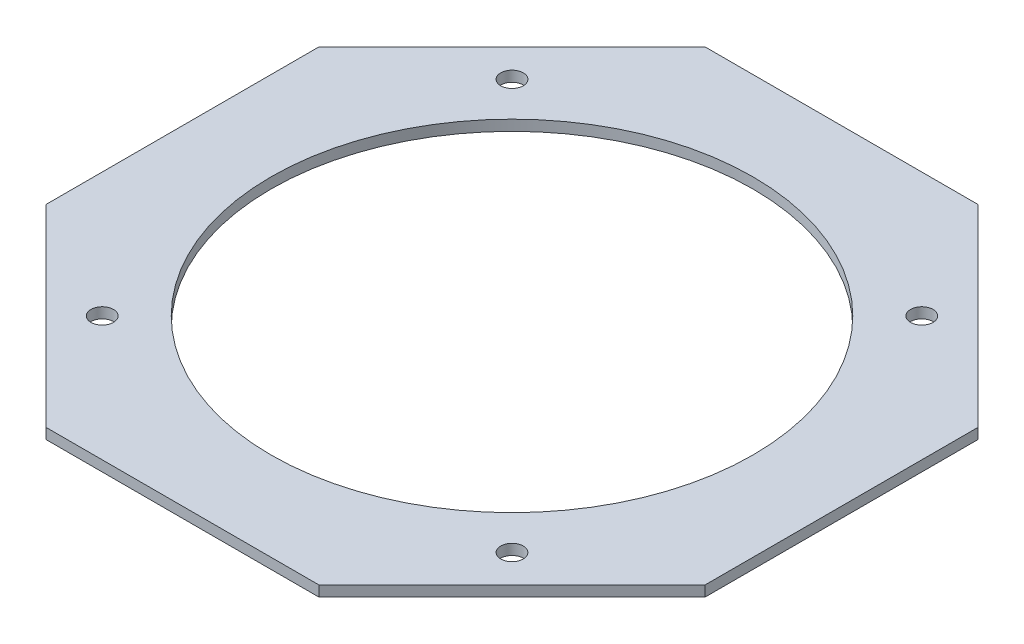
ISO-10303-21;
HEADER;
FILE_DESCRIPTION(('STEP AP214'),'2;1');
FILE_NAME('part.step','',(''),(''),'','','');
FILE_SCHEMA(('AUTOMOTIVE_DESIGN { 1 0 10303 214 1 1 1 1 }'));
ENDSEC;
DATA;
#1=APPLICATION_CONTEXT('core data for automotive mechanical design processes');
#2=APPLICATION_PROTOCOL_DEFINITION('international standard','automotive_design',2000,#1);
#3=PRODUCT_CONTEXT('',#1,'mechanical');
#4=PRODUCT('Part','Part','',(#3));
#5=PRODUCT_RELATED_PRODUCT_CATEGORY('part','',(#4));
#6=PRODUCT_DEFINITION_FORMATION('','',#4);
#7=PRODUCT_DEFINITION_CONTEXT('part definition',#1,'design');
#8=PRODUCT_DEFINITION('design','',#6,#7);
#9=PRODUCT_DEFINITION_SHAPE('','',#8);
#10=(LENGTH_UNIT() NAMED_UNIT(*) SI_UNIT(.MILLI.,.METRE.));
#11=(NAMED_UNIT(*) PLANE_ANGLE_UNIT() SI_UNIT($,.RADIAN.));
#12=(NAMED_UNIT(*) SI_UNIT($,.STERADIAN.) SOLID_ANGLE_UNIT());
#13=UNCERTAINTY_MEASURE_WITH_UNIT(LENGTH_MEASURE(1.E-05),#10,'distance_accuracy_value','');
#14=(GEOMETRIC_REPRESENTATION_CONTEXT(3) GLOBAL_UNCERTAINTY_ASSIGNED_CONTEXT((#13)) GLOBAL_UNIT_ASSIGNED_CONTEXT((#10,
#11,#12)) REPRESENTATION_CONTEXT('',''));
#15=CARTESIAN_POINT('',(0.,0.,0.));
#16=DIRECTION('',(0.,0.,1.));
#17=DIRECTION('',(1.,0.,0.));
#18=AXIS2_PLACEMENT_3D('',#15,#16,#17);
#19=CARTESIAN_POINT('',(23.64745227588,1.83,57.09));
#20=DIRECTION('',(-0.707106781186547,0.,-0.707106781186547));
#21=DIRECTION('',(-0.707106781186548,0.,0.707106781186548));
#22=AXIS2_PLACEMENT_3D('',#19,#20,#21);
#23=PLANE('',#22);
#24=DIRECTION('',(0.707106781186547,0.,-0.707106781186547));
#25=VECTOR('',#24,1.);
#26=CARTESIAN_POINT('',(23.64745227588,0.,57.09));
#27=LINE('',#26,#25);
#28=CARTESIAN_POINT('',(23.64745227588,0.,57.09));
#29=VERTEX_POINT('',#28);
#30=CARTESIAN_POINT('',(57.09,0.,23.64745227588));
#31=VERTEX_POINT('',#30);
#32=EDGE_CURVE('E130',#29,#31,#27,.T.);
#33=ORIENTED_EDGE('',*,*,#32,.T.);
#34=DIRECTION('',(0.,-1.,0.));
#35=VECTOR('',#34,1.);
#36=CARTESIAN_POINT('',(57.09,1.83,23.64745227588));
#37=LINE('',#36,#35);
#38=CARTESIAN_POINT('',(57.09,1.83,23.64745227588));
#39=VERTEX_POINT('',#38);
#40=EDGE_CURVE('E11',#39,#31,#37,.T.);
#41=ORIENTED_EDGE('',*,*,#40,.F.);
#42=DIRECTION('',(0.707106781186547,0.,-0.707106781186547));
#43=VECTOR('',#42,1.);
#44=CARTESIAN_POINT('',(23.64745227588,1.83,57.09));
#45=LINE('',#44,#43);
#46=CARTESIAN_POINT('',(23.64745227588,1.83,57.09));
#47=VERTEX_POINT('',#46);
#48=EDGE_CURVE('E145',#47,#39,#45,.T.);
#49=ORIENTED_EDGE('',*,*,#48,.F.);
#50=DIRECTION('',(0.,-1.,0.));
#51=VECTOR('',#50,1.);
#52=CARTESIAN_POINT('',(23.64745227588,1.83,57.09));
#53=LINE('',#52,#51);
#54=EDGE_CURVE('E126',#47,#29,#53,.T.);
#55=ORIENTED_EDGE('',*,*,#54,.T.);
#56=EDGE_LOOP('',(#33,#41,#49,#55));
#57=FACE_BOUND('',#56,.T.);
#58=ADVANCED_FACE('F34',(#57),#23,.F.);
#59=CARTESIAN_POINT('',(57.09,1.83,23.64745227588));
#60=DIRECTION('',(-1.,0.,0.));
#61=DIRECTION('',(0.,0.,1.));
#62=AXIS2_PLACEMENT_3D('',#59,#60,#61);
#63=PLANE('',#62);
#64=DIRECTION('',(0.,0.,-1.));
#65=VECTOR('',#64,1.);
#66=CARTESIAN_POINT('',(57.09,0.,23.64745227588));
#67=LINE('',#66,#65);
#68=CARTESIAN_POINT('',(57.09,0.,-23.64745227588));
#69=VERTEX_POINT('',#68);
#70=EDGE_CURVE('E133',#31,#69,#67,.T.);
#71=ORIENTED_EDGE('',*,*,#70,.T.);
#72=DIRECTION('',(0.,-1.,0.));
#73=VECTOR('',#72,1.);
#74=CARTESIAN_POINT('',(57.09,1.83,-23.64745227588));
#75=LINE('',#74,#73);
#76=CARTESIAN_POINT('',(57.09,1.83,-23.64745227588));
#77=VERTEX_POINT('',#76);
#78=EDGE_CURVE('E42',#77,#69,#75,.T.);
#79=ORIENTED_EDGE('',*,*,#78,.F.);
#80=DIRECTION('',(0.,0.,-1.));
#81=VECTOR('',#80,1.);
#82=CARTESIAN_POINT('',(57.09,1.83,23.64745227588));
#83=LINE('',#82,#81);
#84=EDGE_CURVE('E93',#39,#77,#83,.T.);
#85=ORIENTED_EDGE('',*,*,#84,.F.);
#86=ORIENTED_EDGE('',*,*,#40,.T.);
#87=EDGE_LOOP('',(#71,#79,#85,#86));
#88=FACE_BOUND('',#87,.T.);
#89=ADVANCED_FACE('F227',(#88),#63,.F.);
#90=CARTESIAN_POINT('',(57.09,1.83,-23.64745227588));
#91=DIRECTION('',(-0.707106781186547,0.,0.707106781186548));
#92=DIRECTION('',(0.707106781186548,0.,0.707106781186547));
#93=AXIS2_PLACEMENT_3D('',#90,#91,#92);
#94=PLANE('',#93);
#95=DIRECTION('',(-0.707106781186548,0.,-0.707106781186547));
#96=VECTOR('',#95,1.);
#97=CARTESIAN_POINT('',(57.09,0.,-23.64745227588));
#98=LINE('',#97,#96);
#99=CARTESIAN_POINT('',(23.64745227588,0.,-57.09));
#100=VERTEX_POINT('',#99);
#101=EDGE_CURVE('E136',#69,#100,#98,.T.);
#102=ORIENTED_EDGE('',*,*,#101,.T.);
#103=DIRECTION('',(0.,-1.,0.));
#104=VECTOR('',#103,1.);
#105=CARTESIAN_POINT('',(23.64745227588,1.83,-57.09));
#106=LINE('',#105,#104);
#107=CARTESIAN_POINT('',(23.64745227588,1.83,-57.09));
#108=VERTEX_POINT('',#107);
#109=EDGE_CURVE('E152',#108,#100,#106,.T.);
#110=ORIENTED_EDGE('',*,*,#109,.F.);
#111=DIRECTION('',(-0.707106781186548,0.,-0.707106781186547));
#112=VECTOR('',#111,1.);
#113=CARTESIAN_POINT('',(57.09,1.83,-23.64745227588));
#114=LINE('',#113,#112);
#115=EDGE_CURVE('E160',#77,#108,#114,.T.);
#116=ORIENTED_EDGE('',*,*,#115,.F.);
#117=ORIENTED_EDGE('',*,*,#78,.T.);
#118=EDGE_LOOP('',(#102,#110,#116,#117));
#119=FACE_BOUND('',#118,.T.);
#120=ADVANCED_FACE('F158',(#119),#94,.F.);
#121=CARTESIAN_POINT('',(23.64745227588,1.83,-57.09));
#122=DIRECTION('',(0.,0.,1.));
#123=DIRECTION('',(1.,0.,0.));
#124=AXIS2_PLACEMENT_3D('',#121,#122,#123);
#125=PLANE('',#124);
#126=DIRECTION('',(-1.,0.,0.));
#127=VECTOR('',#126,1.);
#128=CARTESIAN_POINT('',(23.64745227588,0.,-57.09));
#129=LINE('',#128,#127);
#130=CARTESIAN_POINT('',(-23.64745227588,0.,-57.09));
#131=VERTEX_POINT('',#130);
#132=EDGE_CURVE('E138',#100,#131,#129,.T.);
#133=ORIENTED_EDGE('',*,*,#132,.T.);
#134=DIRECTION('',(0.,-1.,0.));
#135=VECTOR('',#134,1.);
#136=CARTESIAN_POINT('',(-23.64745227588,1.83,-57.09));
#137=LINE('',#136,#135);
#138=CARTESIAN_POINT('',(-23.64745227588,1.83,-57.09));
#139=VERTEX_POINT('',#138);
#140=EDGE_CURVE('E149',#139,#131,#137,.T.);
#141=ORIENTED_EDGE('',*,*,#140,.F.);
#142=DIRECTION('',(-1.,0.,0.));
#143=VECTOR('',#142,1.);
#144=CARTESIAN_POINT('',(23.64745227588,1.83,-57.09));
#145=LINE('',#144,#143);
#146=EDGE_CURVE('E172',#108,#139,#145,.T.);
#147=ORIENTED_EDGE('',*,*,#146,.F.);
#148=ORIENTED_EDGE('',*,*,#109,.T.);
#149=EDGE_LOOP('',(#133,#141,#147,#148));
#150=FACE_BOUND('',#149,.T.);
#151=ADVANCED_FACE('F168',(#150),#125,.F.);
#152=CARTESIAN_POINT('',(-23.64745227588,1.83,-57.09));
#153=DIRECTION('',(0.707106781186548,0.,0.707106781186547));
#154=DIRECTION('',(0.707106781186547,0.,-0.707106781186548));
#155=AXIS2_PLACEMENT_3D('',#152,#153,#154);
#156=PLANE('',#155);
#157=DIRECTION('',(-0.707106781186547,0.,0.707106781186548));
#158=VECTOR('',#157,1.);
#159=CARTESIAN_POINT('',(-23.64745227588,0.,-57.09));
#160=LINE('',#159,#158);
#161=CARTESIAN_POINT('',(-57.09,0.,-23.64745227588));
#162=VERTEX_POINT('',#161);
#163=EDGE_CURVE('E140',#131,#162,#160,.T.);
#164=ORIENTED_EDGE('',*,*,#163,.T.);
#165=DIRECTION('',(0.,-1.,0.));
#166=VECTOR('',#165,1.);
#167=CARTESIAN_POINT('',(-57.09,1.83,-23.64745227588));
#168=LINE('',#167,#166);
#169=CARTESIAN_POINT('',(-57.09,1.83,-23.64745227588));
#170=VERTEX_POINT('',#169);
#171=EDGE_CURVE('E121',#170,#162,#168,.T.);
#172=ORIENTED_EDGE('',*,*,#171,.F.);
#173=DIRECTION('',(-0.707106781186547,0.,0.707106781186548));
#174=VECTOR('',#173,1.);
#175=CARTESIAN_POINT('',(-23.64745227588,1.83,-57.09));
#176=LINE('',#175,#174);
#177=EDGE_CURVE('E112',#139,#170,#176,.T.);
#178=ORIENTED_EDGE('',*,*,#177,.F.);
#179=ORIENTED_EDGE('',*,*,#140,.T.);
#180=EDGE_LOOP('',(#164,#172,#178,#179));
#181=FACE_BOUND('',#180,.T.);
#182=ADVANCED_FACE('F171',(#181),#156,.F.);
#183=CARTESIAN_POINT('',(-57.09,1.83,-23.64745227588));
#184=DIRECTION('',(1.,0.,0.));
#185=DIRECTION('',(0.,0.,-1.));
#186=AXIS2_PLACEMENT_3D('',#183,#184,#185);
#187=PLANE('',#186);
#188=DIRECTION('',(0.,0.,1.));
#189=VECTOR('',#188,1.);
#190=CARTESIAN_POINT('',(-57.09,0.,-23.64745227588));
#191=LINE('',#190,#189);
#192=CARTESIAN_POINT('',(-57.09,0.,23.64745227588));
#193=VERTEX_POINT('',#192);
#194=EDGE_CURVE('E120',#162,#193,#191,.T.);
#195=ORIENTED_EDGE('',*,*,#194,.T.);
#196=DIRECTION('',(0.,-1.,0.));
#197=VECTOR('',#196,1.);
#198=CARTESIAN_POINT('',(-57.09,1.83,23.64745227588));
#199=LINE('',#198,#197);
#200=CARTESIAN_POINT('',(-57.09,1.83,23.64745227588));
#201=VERTEX_POINT('',#200);
#202=EDGE_CURVE('E117',#201,#193,#199,.T.);
#203=ORIENTED_EDGE('',*,*,#202,.F.);
#204=DIRECTION('',(0.,0.,1.));
#205=VECTOR('',#204,1.);
#206=CARTESIAN_POINT('',(-57.09,1.83,-23.64745227588));
#207=LINE('',#206,#205);
#208=EDGE_CURVE('E106',#170,#201,#207,.T.);
#209=ORIENTED_EDGE('',*,*,#208,.F.);
#210=ORIENTED_EDGE('',*,*,#171,.T.);
#211=EDGE_LOOP('',(#195,#203,#209,#210));
#212=FACE_BOUND('',#211,.T.);
#213=ADVANCED_FACE('F118',(#212),#187,.F.);
#214=CARTESIAN_POINT('',(-57.09,1.83,23.64745227588));
#215=DIRECTION('',(0.707106781186547,0.,-0.707106781186548));
#216=DIRECTION('',(-0.707106781186548,0.,-0.707106781186547));
#217=AXIS2_PLACEMENT_3D('',#214,#215,#216);
#218=PLANE('',#217);
#219=DIRECTION('',(0.707106781186548,0.,0.707106781186547));
#220=VECTOR('',#219,1.);
#221=CARTESIAN_POINT('',(-57.09,0.,23.64745227588));
#222=LINE('',#221,#220);
#223=CARTESIAN_POINT('',(-23.64745227588,0.,57.09));
#224=VERTEX_POINT('',#223);
#225=EDGE_CURVE('E79',#193,#224,#222,.T.);
#226=ORIENTED_EDGE('',*,*,#225,.T.);
#227=DIRECTION('',(0.,-1.,0.));
#228=VECTOR('',#227,1.);
#229=CARTESIAN_POINT('',(-23.64745227588,1.83,57.09));
#230=LINE('',#229,#228);
#231=CARTESIAN_POINT('',(-23.64745227588,1.83,57.09));
#232=VERTEX_POINT('',#231);
#233=EDGE_CURVE('E122',#232,#224,#230,.T.);
#234=ORIENTED_EDGE('',*,*,#233,.F.);
#235=DIRECTION('',(0.707106781186548,0.,0.707106781186547));
#236=VECTOR('',#235,1.);
#237=CARTESIAN_POINT('',(-57.09,1.83,23.64745227588));
#238=LINE('',#237,#236);
#239=EDGE_CURVE('E110',#201,#232,#238,.T.);
#240=ORIENTED_EDGE('',*,*,#239,.F.);
#241=ORIENTED_EDGE('',*,*,#202,.T.);
#242=EDGE_LOOP('',(#226,#234,#240,#241));
#243=FACE_BOUND('',#242,.T.);
#244=ADVANCED_FACE('F124',(#243),#218,.F.);
#245=CARTESIAN_POINT('',(-23.64745227588,1.83,57.09));
#246=DIRECTION('',(0.,0.,-1.));
#247=DIRECTION('',(-1.,0.,0.));
#248=AXIS2_PLACEMENT_3D('',#245,#246,#247);
#249=PLANE('',#248);
#250=DIRECTION('',(1.,0.,0.));
#251=VECTOR('',#250,1.);
#252=CARTESIAN_POINT('',(-23.64745227588,0.,57.09));
#253=LINE('',#252,#251);
#254=EDGE_CURVE('E85',#224,#29,#253,.T.);
#255=ORIENTED_EDGE('',*,*,#254,.T.);
#256=ORIENTED_EDGE('',*,*,#54,.F.);
#257=DIRECTION('',(1.,0.,0.));
#258=VECTOR('',#257,1.);
#259=CARTESIAN_POINT('',(-23.64745227588,1.83,57.09));
#260=LINE('',#259,#258);
#261=EDGE_CURVE('E50',#232,#47,#260,.T.);
#262=ORIENTED_EDGE('',*,*,#261,.F.);
#263=ORIENTED_EDGE('',*,*,#233,.T.);
#264=EDGE_LOOP('',(#255,#256,#262,#263));
#265=FACE_BOUND('',#264,.T.);
#266=ADVANCED_FACE('F234',(#265),#249,.F.);
#267=CARTESIAN_POINT('',(0.,1.83,0.));
#268=DIRECTION('',(0.,1.,0.));
#269=DIRECTION('',(0.,0.,1.));
#270=AXIS2_PLACEMENT_3D('',#267,#268,#269);
#271=PLANE('',#270);
#272=CARTESIAN_POINT('',(-35.5,1.83,35.5));
#273=DIRECTION('',(0.,1.,0.));
#274=DIRECTION('',(0.,0.,1.));
#275=AXIS2_PLACEMENT_3D('',#272,#273,#274);
#276=CIRCLE('',#275,1.95);
#277=CARTESIAN_POINT('',(-35.5,1.83,33.55));
#278=VERTEX_POINT('',#277);
#279=EDGE_CURVE('E183',#278,#278,#276,.F.);
#280=ORIENTED_EDGE('',*,*,#279,.T.);
#281=EDGE_LOOP('',(#280));
#282=FACE_BOUND('',#281,.T.);
#283=CARTESIAN_POINT('',(0.,1.83,0.));
#284=DIRECTION('',(0.,1.,0.));
#285=DIRECTION('',(0.,0.,1.));
#286=AXIS2_PLACEMENT_3D('',#283,#284,#285);
#287=CIRCLE('',#286,41.75);
#288=CARTESIAN_POINT('',(0.,1.83,-41.75));
#289=VERTEX_POINT('',#288);
#290=EDGE_CURVE('E186',#289,#289,#287,.F.);
#291=ORIENTED_EDGE('',*,*,#290,.T.);
#292=EDGE_LOOP('',(#291));
#293=FACE_BOUND('',#292,.T.);
#294=CARTESIAN_POINT('',(35.5,1.83,35.5));
#295=DIRECTION('',(0.,1.,0.));
#296=DIRECTION('',(0.,0.,1.));
#297=AXIS2_PLACEMENT_3D('',#294,#295,#296);
#298=CIRCLE('',#297,1.95);
#299=CARTESIAN_POINT('',(35.5,1.83,33.55));
#300=VERTEX_POINT('',#299);
#301=EDGE_CURVE('E189',#300,#300,#298,.F.);
#302=ORIENTED_EDGE('',*,*,#301,.T.);
#303=EDGE_LOOP('',(#302));
#304=FACE_BOUND('',#303,.T.);
#305=CARTESIAN_POINT('',(35.5,1.83,-35.5));
#306=DIRECTION('',(0.,1.,0.));
#307=DIRECTION('',(0.,0.,1.));
#308=AXIS2_PLACEMENT_3D('',#305,#306,#307);
#309=CIRCLE('',#308,1.95);
#310=CARTESIAN_POINT('',(35.5,1.83,-37.45));
#311=VERTEX_POINT('',#310);
#312=EDGE_CURVE('E192',#311,#311,#309,.F.);
#313=ORIENTED_EDGE('',*,*,#312,.T.);
#314=EDGE_LOOP('',(#313));
#315=FACE_BOUND('',#314,.T.);
#316=CARTESIAN_POINT('',(-35.5,1.83,-35.5));
#317=DIRECTION('',(0.,1.,0.));
#318=DIRECTION('',(0.,0.,1.));
#319=AXIS2_PLACEMENT_3D('',#316,#317,#318);
#320=CIRCLE('',#319,1.95);
#321=CARTESIAN_POINT('',(-35.5,1.83,-37.45));
#322=VERTEX_POINT('',#321);
#323=EDGE_CURVE('E134',#322,#322,#320,.F.);
#324=ORIENTED_EDGE('',*,*,#323,.T.);
#325=EDGE_LOOP('',(#324));
#326=FACE_BOUND('',#325,.T.);
#327=ORIENTED_EDGE('',*,*,#48,.T.);
#328=ORIENTED_EDGE('',*,*,#84,.T.);
#329=ORIENTED_EDGE('',*,*,#115,.T.);
#330=ORIENTED_EDGE('',*,*,#146,.T.);
#331=ORIENTED_EDGE('',*,*,#177,.T.);
#332=ORIENTED_EDGE('',*,*,#208,.T.);
#333=ORIENTED_EDGE('',*,*,#239,.T.);
#334=ORIENTED_EDGE('',*,*,#261,.T.);
#335=EDGE_LOOP('',(#327,#328,#329,#330,#331,#332,#333,#334));
#336=FACE_BOUND('',#335,.T.);
#337=ADVANCED_FACE('F108',(#282,#293,#304,#315,#326,#336),#271,.T.);
#338=CARTESIAN_POINT('',(0.,0.,0.));
#339=DIRECTION('',(0.,1.,0.));
#340=DIRECTION('',(0.,0.,1.));
#341=AXIS2_PLACEMENT_3D('',#338,#339,#340);
#342=PLANE('',#341);
#343=CARTESIAN_POINT('',(-35.5,0.,35.5));
#344=DIRECTION('',(0.,1.,0.));
#345=DIRECTION('',(0.,0.,1.));
#346=AXIS2_PLACEMENT_3D('',#343,#344,#345);
#347=CIRCLE('',#346,1.95);
#348=CARTESIAN_POINT('',(-35.5,0.,33.55));
#349=VERTEX_POINT('',#348);
#350=EDGE_CURVE('E199',#349,#349,#347,.T.);
#351=ORIENTED_EDGE('',*,*,#350,.T.);
#352=EDGE_LOOP('',(#351));
#353=FACE_BOUND('',#352,.T.);
#354=CARTESIAN_POINT('',(0.,0.,0.));
#355=DIRECTION('',(0.,1.,0.));
#356=DIRECTION('',(0.,0.,1.));
#357=AXIS2_PLACEMENT_3D('',#354,#355,#356);
#358=CIRCLE('',#357,41.75);
#359=CARTESIAN_POINT('',(0.,0.,-41.75));
#360=VERTEX_POINT('',#359);
#361=EDGE_CURVE('E204',#360,#360,#358,.T.);
#362=ORIENTED_EDGE('',*,*,#361,.T.);
#363=EDGE_LOOP('',(#362));
#364=FACE_BOUND('',#363,.T.);
#365=CARTESIAN_POINT('',(35.5,0.,35.5));
#366=DIRECTION('',(0.,1.,0.));
#367=DIRECTION('',(0.,0.,1.));
#368=AXIS2_PLACEMENT_3D('',#365,#366,#367);
#369=CIRCLE('',#368,1.95);
#370=CARTESIAN_POINT('',(35.5,0.,33.55));
#371=VERTEX_POINT('',#370);
#372=EDGE_CURVE('E196',#371,#371,#369,.T.);
#373=ORIENTED_EDGE('',*,*,#372,.T.);
#374=EDGE_LOOP('',(#373));
#375=FACE_BOUND('',#374,.T.);
#376=CARTESIAN_POINT('',(35.5,0.,-35.5));
#377=DIRECTION('',(0.,1.,0.));
#378=DIRECTION('',(0.,0.,1.));
#379=AXIS2_PLACEMENT_3D('',#376,#377,#378);
#380=CIRCLE('',#379,1.95);
#381=CARTESIAN_POINT('',(35.5,0.,-37.45));
#382=VERTEX_POINT('',#381);
#383=EDGE_CURVE('E195',#382,#382,#380,.T.);
#384=ORIENTED_EDGE('',*,*,#383,.T.);
#385=EDGE_LOOP('',(#384));
#386=FACE_BOUND('',#385,.T.);
#387=CARTESIAN_POINT('',(-35.5,0.,-35.5));
#388=DIRECTION('',(0.,1.,0.));
#389=DIRECTION('',(0.,0.,1.));
#390=AXIS2_PLACEMENT_3D('',#387,#388,#389);
#391=CIRCLE('',#390,1.95);
#392=CARTESIAN_POINT('',(-35.5,0.,-37.45));
#393=VERTEX_POINT('',#392);
#394=EDGE_CURVE('E180',#393,#393,#391,.T.);
#395=ORIENTED_EDGE('',*,*,#394,.T.);
#396=EDGE_LOOP('',(#395));
#397=FACE_BOUND('',#396,.T.);
#398=ORIENTED_EDGE('',*,*,#32,.F.);
#399=ORIENTED_EDGE('',*,*,#254,.F.);
#400=ORIENTED_EDGE('',*,*,#225,.F.);
#401=ORIENTED_EDGE('',*,*,#194,.F.);
#402=ORIENTED_EDGE('',*,*,#163,.F.);
#403=ORIENTED_EDGE('',*,*,#132,.F.);
#404=ORIENTED_EDGE('',*,*,#101,.F.);
#405=ORIENTED_EDGE('',*,*,#70,.F.);
#406=EDGE_LOOP('',(#398,#399,#400,#401,#402,#403,#404,#405));
#407=FACE_BOUND('',#406,.T.);
#408=ADVANCED_FACE('F164',(#353,#364,#375,#386,#397,#407),#342,.F.);
#409=CARTESIAN_POINT('',(-35.5,23.83,-35.5));
#410=DIRECTION('',(0.,-1.,0.));
#411=DIRECTION('',(0.,0.,-1.));
#412=AXIS2_PLACEMENT_3D('',#409,#410,#411);
#413=CYLINDRICAL_SURFACE('',#412,1.95);
#414=CARTESIAN_POINT('',(-35.5,1.83,-37.45));
#415=CARTESIAN_POINT('',(-35.5,1.8109375,-37.45));
#416=CARTESIAN_POINT('',(-35.5,1.791875,-37.45));
#417=CARTESIAN_POINT('',(-35.5,1.75375,-37.45));
#418=CARTESIAN_POINT('',(-35.5,1.7346875,-37.45));
#419=CARTESIAN_POINT('',(-35.5,1.6965625,-37.45));
#420=CARTESIAN_POINT('',(-35.5,1.6775,-37.45));
#421=CARTESIAN_POINT('',(-35.5,1.639375,-37.45));
#422=CARTESIAN_POINT('',(-35.5,1.6203125,-37.45));
#423=CARTESIAN_POINT('',(-35.5,1.5821875,-37.45));
#424=CARTESIAN_POINT('',(-35.5,1.563125,-37.45));
#425=CARTESIAN_POINT('',(-35.5,1.525,-37.45));
#426=CARTESIAN_POINT('',(-35.5,1.5059375,-37.45));
#427=CARTESIAN_POINT('',(-35.5,1.4678125,-37.45));
#428=CARTESIAN_POINT('',(-35.5,1.44875,-37.45));
#429=CARTESIAN_POINT('',(-35.5,1.410625,-37.45));
#430=CARTESIAN_POINT('',(-35.5,1.3915625,-37.45));
#431=CARTESIAN_POINT('',(-35.5,1.3534375,-37.45));
#432=CARTESIAN_POINT('',(-35.5,1.334375,-37.45));
#433=CARTESIAN_POINT('',(-35.5,1.29625,-37.45));
#434=CARTESIAN_POINT('',(-35.5,1.2771875,-37.45));
#435=CARTESIAN_POINT('',(-35.5,1.2390625,-37.45));
#436=CARTESIAN_POINT('',(-35.5,1.22,-37.45));
#437=CARTESIAN_POINT('',(-35.5,1.181875,-37.45));
#438=CARTESIAN_POINT('',(-35.5,1.1628125,-37.45));
#439=CARTESIAN_POINT('',(-35.5,1.1246875,-37.45));
#440=CARTESIAN_POINT('',(-35.5,1.105625,-37.45));
#441=CARTESIAN_POINT('',(-35.5,1.0675,-37.45));
#442=CARTESIAN_POINT('',(-35.5,1.0484375,-37.45));
#443=CARTESIAN_POINT('',(-35.5,1.0103125,-37.45));
#444=CARTESIAN_POINT('',(-35.5,0.991249999999999,-37.45));
#445=CARTESIAN_POINT('',(-35.5,0.953124999999999,-37.45));
#446=CARTESIAN_POINT('',(-35.5,0.934062499999999,-37.45));
#447=CARTESIAN_POINT('',(-35.5,0.895937499999999,-37.45));
#448=CARTESIAN_POINT('',(-35.5,0.876874999999999,-37.45));
#449=CARTESIAN_POINT('',(-35.5,0.838749999999999,-37.45));
#450=CARTESIAN_POINT('',(-35.5,0.819687499999999,-37.45));
#451=CARTESIAN_POINT('',(-35.5,0.781562499999999,-37.45));
#452=CARTESIAN_POINT('',(-35.5,0.762499999999999,-37.45));
#453=CARTESIAN_POINT('',(-35.5,0.724374999999999,-37.45));
#454=CARTESIAN_POINT('',(-35.5,0.705312499999999,-37.45));
#455=CARTESIAN_POINT('',(-35.5,0.667187499999999,-37.45));
#456=CARTESIAN_POINT('',(-35.5,0.648124999999999,-37.45));
#457=CARTESIAN_POINT('',(-35.5,0.609999999999999,-37.45));
#458=CARTESIAN_POINT('',(-35.5,0.590937499999999,-37.45));
#459=CARTESIAN_POINT('',(-35.5,0.552812499999999,-37.45));
#460=CARTESIAN_POINT('',(-35.5,0.53375,-37.45));
#461=CARTESIAN_POINT('',(-35.5,0.495625,-37.45));
#462=CARTESIAN_POINT('',(-35.5,0.4765625,-37.45));
#463=CARTESIAN_POINT('',(-35.5,0.4384375,-37.45));
#464=CARTESIAN_POINT('',(-35.5,0.419375,-37.45));
#465=CARTESIAN_POINT('',(-35.5,0.38125,-37.45));
#466=CARTESIAN_POINT('',(-35.5,0.3621875,-37.45));
#467=CARTESIAN_POINT('',(-35.5,0.3240625,-37.45));
#468=CARTESIAN_POINT('',(-35.5,0.305,-37.45));
#469=CARTESIAN_POINT('',(-35.5,0.266875,-37.45));
#470=CARTESIAN_POINT('',(-35.5,0.2478125,-37.45));
#471=CARTESIAN_POINT('',(-35.5,0.2096875,-37.45));
#472=CARTESIAN_POINT('',(-35.5,0.190625,-37.45));
#473=CARTESIAN_POINT('',(-35.5,0.1525,-37.45));
#474=CARTESIAN_POINT('',(-35.5,0.1334375,-37.45));
#475=CARTESIAN_POINT('',(-35.5,0.0953124999999999,-37.45));
#476=CARTESIAN_POINT('',(-35.5,0.0762499999999999,-37.45));
#477=CARTESIAN_POINT('',(-35.5,0.038125,-37.45));
#478=CARTESIAN_POINT('',(-35.5,0.0190625,-37.45));
#479=CARTESIAN_POINT('',(-35.5,0.,-37.45));
#480=B_SPLINE_CURVE_WITH_KNOTS('',3,(#414,#415,#416,#417,#418,#419,#420,#421,#422,#423,#424,
#425,#426,#427,#428,#429,#430,#431,#432,#433,#434,#435,#436,#437,#438,#439,#440,#441,#442,#443,
#444,#445,#446,#447,#448,#449,#450,#451,#452,#453,#454,#455,#456,#457,#458,#459,#460,#461,#462,
#463,#464,#465,#466,#467,#468,#469,#470,#471,#472,#473,#474,#475,#476,#477,#478,#479),
.UNSPECIFIED.,.F.,.F.,(4,2,2,2,2,2,2,2,2,2,2,2,2,2,2,2,2,2,2,2,2,2,2,2,2,2,2,2,2,2,2,2,4),(0.,
0.0571874999999999,0.114375,0.1715625,0.22875,0.2859375,0.343125,0.4003125,0.4575,0.5146875,
0.571874999999999,0.629062499999999,0.686249999999999,0.743437499999999,0.800624999999999,
0.857812499999999,0.914999999999999,0.972187499999999,1.029375,1.0865625,1.14375,1.2009375,
1.258125,1.3153125,1.3725,1.4296875,1.486875,1.5440625,1.60125,1.6584375,1.715625,1.7728125,
1.83),.UNSPECIFIED.);
#481=EDGE_CURVE('BSEAM292',#322,#393,#480,.T.);
#482=ORIENTED_EDGE('',*,*,#323,.F.);
#483=ORIENTED_EDGE('',*,*,#394,.F.);
#484=ORIENTED_EDGE('',*,*,#481,.T.);
#485=ORIENTED_EDGE('',*,*,#481,.F.);
#486=EDGE_LOOP('',(#482,#484,#483,#485));
#487=FACE_BOUND('',#486,.T.);
#488=ADVANCED_FACE('F292',(#487),#413,.F.);
#489=CARTESIAN_POINT('',(35.5,23.83,-35.5));
#490=DIRECTION('',(0.,-1.,0.));
#491=DIRECTION('',(0.,0.,-1.));
#492=AXIS2_PLACEMENT_3D('',#489,#490,#491);
#493=CYLINDRICAL_SURFACE('',#492,1.95);
#494=CARTESIAN_POINT('',(35.5,1.83,-37.45));
#495=CARTESIAN_POINT('',(35.5,1.8109375,-37.45));
#496=CARTESIAN_POINT('',(35.5,1.791875,-37.45));
#497=CARTESIAN_POINT('',(35.5,1.75375,-37.45));
#498=CARTESIAN_POINT('',(35.5,1.7346875,-37.45));
#499=CARTESIAN_POINT('',(35.5,1.6965625,-37.45));
#500=CARTESIAN_POINT('',(35.5,1.6775,-37.45));
#501=CARTESIAN_POINT('',(35.5,1.639375,-37.45));
#502=CARTESIAN_POINT('',(35.5,1.6203125,-37.45));
#503=CARTESIAN_POINT('',(35.5,1.5821875,-37.45));
#504=CARTESIAN_POINT('',(35.5,1.563125,-37.45));
#505=CARTESIAN_POINT('',(35.5,1.525,-37.45));
#506=CARTESIAN_POINT('',(35.5,1.5059375,-37.45));
#507=CARTESIAN_POINT('',(35.5,1.4678125,-37.45));
#508=CARTESIAN_POINT('',(35.5,1.44875,-37.45));
#509=CARTESIAN_POINT('',(35.5,1.410625,-37.45));
#510=CARTESIAN_POINT('',(35.5,1.3915625,-37.45));
#511=CARTESIAN_POINT('',(35.5,1.3534375,-37.45));
#512=CARTESIAN_POINT('',(35.5,1.334375,-37.45));
#513=CARTESIAN_POINT('',(35.5,1.29625,-37.45));
#514=CARTESIAN_POINT('',(35.5,1.2771875,-37.45));
#515=CARTESIAN_POINT('',(35.5,1.2390625,-37.45));
#516=CARTESIAN_POINT('',(35.5,1.22,-37.45));
#517=CARTESIAN_POINT('',(35.5,1.181875,-37.45));
#518=CARTESIAN_POINT('',(35.5,1.1628125,-37.45));
#519=CARTESIAN_POINT('',(35.5,1.1246875,-37.45));
#520=CARTESIAN_POINT('',(35.5,1.105625,-37.45));
#521=CARTESIAN_POINT('',(35.5,1.0675,-37.45));
#522=CARTESIAN_POINT('',(35.5,1.0484375,-37.45));
#523=CARTESIAN_POINT('',(35.5,1.0103125,-37.45));
#524=CARTESIAN_POINT('',(35.5,0.991249999999999,-37.45));
#525=CARTESIAN_POINT('',(35.5,0.953124999999999,-37.45));
#526=CARTESIAN_POINT('',(35.5,0.934062499999999,-37.45));
#527=CARTESIAN_POINT('',(35.5,0.895937499999999,-37.45));
#528=CARTESIAN_POINT('',(35.5,0.876874999999999,-37.45));
#529=CARTESIAN_POINT('',(35.5,0.838749999999999,-37.45));
#530=CARTESIAN_POINT('',(35.5,0.819687499999999,-37.45));
#531=CARTESIAN_POINT('',(35.5,0.781562499999999,-37.45));
#532=CARTESIAN_POINT('',(35.5,0.762499999999999,-37.45));
#533=CARTESIAN_POINT('',(35.5,0.724374999999999,-37.45));
#534=CARTESIAN_POINT('',(35.5,0.705312499999999,-37.45));
#535=CARTESIAN_POINT('',(35.5,0.667187499999999,-37.45));
#536=CARTESIAN_POINT('',(35.5,0.648124999999999,-37.45));
#537=CARTESIAN_POINT('',(35.5,0.609999999999999,-37.45));
#538=CARTESIAN_POINT('',(35.5,0.590937499999999,-37.45));
#539=CARTESIAN_POINT('',(35.5,0.552812499999999,-37.45));
#540=CARTESIAN_POINT('',(35.5,0.53375,-37.45));
#541=CARTESIAN_POINT('',(35.5,0.495625,-37.45));
#542=CARTESIAN_POINT('',(35.5,0.4765625,-37.45));
#543=CARTESIAN_POINT('',(35.5,0.4384375,-37.45));
#544=CARTESIAN_POINT('',(35.5,0.419375,-37.45));
#545=CARTESIAN_POINT('',(35.5,0.38125,-37.45));
#546=CARTESIAN_POINT('',(35.5,0.3621875,-37.45));
#547=CARTESIAN_POINT('',(35.5,0.3240625,-37.45));
#548=CARTESIAN_POINT('',(35.5,0.305,-37.45));
#549=CARTESIAN_POINT('',(35.5,0.266875,-37.45));
#550=CARTESIAN_POINT('',(35.5,0.2478125,-37.45));
#551=CARTESIAN_POINT('',(35.5,0.2096875,-37.45));
#552=CARTESIAN_POINT('',(35.5,0.190625,-37.45));
#553=CARTESIAN_POINT('',(35.5,0.1525,-37.45));
#554=CARTESIAN_POINT('',(35.5,0.1334375,-37.45));
#555=CARTESIAN_POINT('',(35.5,0.0953124999999999,-37.45));
#556=CARTESIAN_POINT('',(35.5,0.0762499999999999,-37.45));
#557=CARTESIAN_POINT('',(35.5,0.038125,-37.45));
#558=CARTESIAN_POINT('',(35.5,0.0190625,-37.45));
#559=CARTESIAN_POINT('',(35.5,0.,-37.45));
#560=B_SPLINE_CURVE_WITH_KNOTS('',3,(#494,#495,#496,#497,#498,#499,#500,#501,#502,#503,#504,
#505,#506,#507,#508,#509,#510,#511,#512,#513,#514,#515,#516,#517,#518,#519,#520,#521,#522,#523,
#524,#525,#526,#527,#528,#529,#530,#531,#532,#533,#534,#535,#536,#537,#538,#539,#540,#541,#542,
#543,#544,#545,#546,#547,#548,#549,#550,#551,#552,#553,#554,#555,#556,#557,#558,#559),
.UNSPECIFIED.,.F.,.F.,(4,2,2,2,2,2,2,2,2,2,2,2,2,2,2,2,2,2,2,2,2,2,2,2,2,2,2,2,2,2,2,2,4),(0.,
0.0571874999999999,0.114375,0.1715625,0.22875,0.2859375,0.343125,0.4003125,0.4575,0.5146875,
0.571874999999999,0.629062499999999,0.686249999999999,0.743437499999999,0.800624999999999,
0.857812499999999,0.914999999999999,0.972187499999999,1.029375,1.0865625,1.14375,1.2009375,
1.258125,1.3153125,1.3725,1.4296875,1.486875,1.5440625,1.60125,1.6584375,1.715625,1.7728125,
1.83),.UNSPECIFIED.);
#561=EDGE_CURVE('BSEAM222',#311,#382,#560,.T.);
#562=ORIENTED_EDGE('',*,*,#312,.F.);
#563=ORIENTED_EDGE('',*,*,#383,.F.);
#564=ORIENTED_EDGE('',*,*,#561,.T.);
#565=ORIENTED_EDGE('',*,*,#561,.F.);
#566=EDGE_LOOP('',(#562,#564,#563,#565));
#567=FACE_BOUND('',#566,.T.);
#568=ADVANCED_FACE('F222',(#567),#493,.F.);
#569=CARTESIAN_POINT('',(35.5,23.83,35.5));
#570=DIRECTION('',(0.,-1.,0.));
#571=DIRECTION('',(0.,0.,-1.));
#572=AXIS2_PLACEMENT_3D('',#569,#570,#571);
#573=CYLINDRICAL_SURFACE('',#572,1.95);
#574=CARTESIAN_POINT('',(35.5,1.83,33.55));
#575=CARTESIAN_POINT('',(35.5,1.8109375,33.55));
#576=CARTESIAN_POINT('',(35.5,1.791875,33.55));
#577=CARTESIAN_POINT('',(35.5,1.75375,33.55));
#578=CARTESIAN_POINT('',(35.5,1.7346875,33.55));
#579=CARTESIAN_POINT('',(35.5,1.6965625,33.55));
#580=CARTESIAN_POINT('',(35.5,1.6775,33.55));
#581=CARTESIAN_POINT('',(35.5,1.639375,33.55));
#582=CARTESIAN_POINT('',(35.5,1.6203125,33.55));
#583=CARTESIAN_POINT('',(35.5,1.5821875,33.55));
#584=CARTESIAN_POINT('',(35.5,1.563125,33.55));
#585=CARTESIAN_POINT('',(35.5,1.525,33.55));
#586=CARTESIAN_POINT('',(35.5,1.5059375,33.55));
#587=CARTESIAN_POINT('',(35.5,1.4678125,33.55));
#588=CARTESIAN_POINT('',(35.5,1.44875,33.55));
#589=CARTESIAN_POINT('',(35.5,1.410625,33.55));
#590=CARTESIAN_POINT('',(35.5,1.3915625,33.55));
#591=CARTESIAN_POINT('',(35.5,1.3534375,33.55));
#592=CARTESIAN_POINT('',(35.5,1.334375,33.55));
#593=CARTESIAN_POINT('',(35.5,1.29625,33.55));
#594=CARTESIAN_POINT('',(35.5,1.2771875,33.55));
#595=CARTESIAN_POINT('',(35.5,1.2390625,33.55));
#596=CARTESIAN_POINT('',(35.5,1.22,33.55));
#597=CARTESIAN_POINT('',(35.5,1.181875,33.55));
#598=CARTESIAN_POINT('',(35.5,1.1628125,33.55));
#599=CARTESIAN_POINT('',(35.5,1.1246875,33.55));
#600=CARTESIAN_POINT('',(35.5,1.105625,33.55));
#601=CARTESIAN_POINT('',(35.5,1.0675,33.55));
#602=CARTESIAN_POINT('',(35.5,1.0484375,33.55));
#603=CARTESIAN_POINT('',(35.5,1.0103125,33.55));
#604=CARTESIAN_POINT('',(35.5,0.991249999999999,33.55));
#605=CARTESIAN_POINT('',(35.5,0.953124999999999,33.55));
#606=CARTESIAN_POINT('',(35.5,0.934062499999999,33.55));
#607=CARTESIAN_POINT('',(35.5,0.895937499999999,33.55));
#608=CARTESIAN_POINT('',(35.5,0.876874999999999,33.55));
#609=CARTESIAN_POINT('',(35.5,0.838749999999999,33.55));
#610=CARTESIAN_POINT('',(35.5,0.819687499999999,33.55));
#611=CARTESIAN_POINT('',(35.5,0.781562499999999,33.55));
#612=CARTESIAN_POINT('',(35.5,0.762499999999999,33.55));
#613=CARTESIAN_POINT('',(35.5,0.724374999999999,33.55));
#614=CARTESIAN_POINT('',(35.5,0.705312499999999,33.55));
#615=CARTESIAN_POINT('',(35.5,0.667187499999999,33.55));
#616=CARTESIAN_POINT('',(35.5,0.648124999999999,33.55));
#617=CARTESIAN_POINT('',(35.5,0.609999999999999,33.55));
#618=CARTESIAN_POINT('',(35.5,0.590937499999999,33.55));
#619=CARTESIAN_POINT('',(35.5,0.552812499999999,33.55));
#620=CARTESIAN_POINT('',(35.5,0.53375,33.55));
#621=CARTESIAN_POINT('',(35.5,0.495625,33.55));
#622=CARTESIAN_POINT('',(35.5,0.4765625,33.55));
#623=CARTESIAN_POINT('',(35.5,0.4384375,33.55));
#624=CARTESIAN_POINT('',(35.5,0.419375,33.55));
#625=CARTESIAN_POINT('',(35.5,0.38125,33.55));
#626=CARTESIAN_POINT('',(35.5,0.3621875,33.55));
#627=CARTESIAN_POINT('',(35.5,0.3240625,33.55));
#628=CARTESIAN_POINT('',(35.5,0.305,33.55));
#629=CARTESIAN_POINT('',(35.5,0.266875,33.55));
#630=CARTESIAN_POINT('',(35.5,0.2478125,33.55));
#631=CARTESIAN_POINT('',(35.5,0.2096875,33.55));
#632=CARTESIAN_POINT('',(35.5,0.190625,33.55));
#633=CARTESIAN_POINT('',(35.5,0.1525,33.55));
#634=CARTESIAN_POINT('',(35.5,0.1334375,33.55));
#635=CARTESIAN_POINT('',(35.5,0.0953124999999999,33.55));
#636=CARTESIAN_POINT('',(35.5,0.0762499999999999,33.55));
#637=CARTESIAN_POINT('',(35.5,0.038125,33.55));
#638=CARTESIAN_POINT('',(35.5,0.0190625,33.55));
#639=CARTESIAN_POINT('',(35.5,0.,33.55));
#640=B_SPLINE_CURVE_WITH_KNOTS('',3,(#574,#575,#576,#577,#578,#579,#580,#581,#582,#583,#584,
#585,#586,#587,#588,#589,#590,#591,#592,#593,#594,#595,#596,#597,#598,#599,#600,#601,#602,#603,
#604,#605,#606,#607,#608,#609,#610,#611,#612,#613,#614,#615,#616,#617,#618,#619,#620,#621,#622,
#623,#624,#625,#626,#627,#628,#629,#630,#631,#632,#633,#634,#635,#636,#637,#638,#639),
.UNSPECIFIED.,.F.,.F.,(4,2,2,2,2,2,2,2,2,2,2,2,2,2,2,2,2,2,2,2,2,2,2,2,2,2,2,2,2,2,2,2,4),(0.,
0.0571874999999999,0.114375,0.1715625,0.22875,0.2859375,0.343125,0.4003125,0.4575,0.5146875,
0.571874999999999,0.629062499999999,0.686249999999999,0.743437499999999,0.800624999999999,
0.857812499999999,0.914999999999999,0.972187499999999,1.029375,1.0865625,1.14375,1.2009375,
1.258125,1.3153125,1.3725,1.4296875,1.486875,1.5440625,1.60125,1.6584375,1.715625,1.7728125,
1.83),.UNSPECIFIED.);
#641=EDGE_CURVE('BSEAM213',#300,#371,#640,.T.);
#642=ORIENTED_EDGE('',*,*,#301,.F.);
#643=ORIENTED_EDGE('',*,*,#372,.F.);
#644=ORIENTED_EDGE('',*,*,#641,.T.);
#645=ORIENTED_EDGE('',*,*,#641,.F.);
#646=EDGE_LOOP('',(#642,#644,#643,#645));
#647=FACE_BOUND('',#646,.T.);
#648=ADVANCED_FACE('F213',(#647),#573,.F.);
#649=CARTESIAN_POINT('',(0.,23.83,0.));
#650=DIRECTION('',(0.,-1.,0.));
#651=DIRECTION('',(0.,0.,-1.));
#652=AXIS2_PLACEMENT_3D('',#649,#650,#651);
#653=CYLINDRICAL_SURFACE('',#652,41.75);
#654=CARTESIAN_POINT('',(0.,1.83,-41.75));
#655=CARTESIAN_POINT('',(0.,1.8109375,-41.75));
#656=CARTESIAN_POINT('',(0.,1.791875,-41.75));
#657=CARTESIAN_POINT('',(0.,1.75375,-41.75));
#658=CARTESIAN_POINT('',(0.,1.7346875,-41.75));
#659=CARTESIAN_POINT('',(0.,1.6965625,-41.75));
#660=CARTESIAN_POINT('',(0.,1.6775,-41.75));
#661=CARTESIAN_POINT('',(0.,1.639375,-41.75));
#662=CARTESIAN_POINT('',(0.,1.6203125,-41.75));
#663=CARTESIAN_POINT('',(0.,1.5821875,-41.75));
#664=CARTESIAN_POINT('',(0.,1.563125,-41.75));
#665=CARTESIAN_POINT('',(0.,1.525,-41.75));
#666=CARTESIAN_POINT('',(0.,1.5059375,-41.75));
#667=CARTESIAN_POINT('',(0.,1.4678125,-41.75));
#668=CARTESIAN_POINT('',(0.,1.44875,-41.75));
#669=CARTESIAN_POINT('',(0.,1.410625,-41.75));
#670=CARTESIAN_POINT('',(0.,1.3915625,-41.75));
#671=CARTESIAN_POINT('',(0.,1.3534375,-41.75));
#672=CARTESIAN_POINT('',(0.,1.334375,-41.75));
#673=CARTESIAN_POINT('',(0.,1.29625,-41.75));
#674=CARTESIAN_POINT('',(0.,1.2771875,-41.75));
#675=CARTESIAN_POINT('',(0.,1.2390625,-41.75));
#676=CARTESIAN_POINT('',(0.,1.22,-41.75));
#677=CARTESIAN_POINT('',(0.,1.181875,-41.75));
#678=CARTESIAN_POINT('',(0.,1.1628125,-41.75));
#679=CARTESIAN_POINT('',(0.,1.1246875,-41.75));
#680=CARTESIAN_POINT('',(0.,1.105625,-41.75));
#681=CARTESIAN_POINT('',(0.,1.0675,-41.75));
#682=CARTESIAN_POINT('',(0.,1.0484375,-41.75));
#683=CARTESIAN_POINT('',(0.,1.0103125,-41.75));
#684=CARTESIAN_POINT('',(0.,0.991249999999999,-41.75));
#685=CARTESIAN_POINT('',(0.,0.953124999999999,-41.75));
#686=CARTESIAN_POINT('',(0.,0.934062499999999,-41.75));
#687=CARTESIAN_POINT('',(0.,0.895937499999999,-41.75));
#688=CARTESIAN_POINT('',(0.,0.876874999999999,-41.75));
#689=CARTESIAN_POINT('',(0.,0.838749999999999,-41.75));
#690=CARTESIAN_POINT('',(0.,0.819687499999999,-41.75));
#691=CARTESIAN_POINT('',(0.,0.781562499999999,-41.75));
#692=CARTESIAN_POINT('',(0.,0.762499999999999,-41.75));
#693=CARTESIAN_POINT('',(0.,0.724374999999999,-41.75));
#694=CARTESIAN_POINT('',(0.,0.705312499999999,-41.75));
#695=CARTESIAN_POINT('',(0.,0.667187499999999,-41.75));
#696=CARTESIAN_POINT('',(0.,0.648124999999999,-41.75));
#697=CARTESIAN_POINT('',(0.,0.609999999999999,-41.75));
#698=CARTESIAN_POINT('',(0.,0.590937499999999,-41.75));
#699=CARTESIAN_POINT('',(0.,0.552812499999999,-41.75));
#700=CARTESIAN_POINT('',(0.,0.53375,-41.75));
#701=CARTESIAN_POINT('',(0.,0.495625,-41.75));
#702=CARTESIAN_POINT('',(0.,0.4765625,-41.75));
#703=CARTESIAN_POINT('',(0.,0.4384375,-41.75));
#704=CARTESIAN_POINT('',(0.,0.419375,-41.75));
#705=CARTESIAN_POINT('',(0.,0.38125,-41.75));
#706=CARTESIAN_POINT('',(0.,0.3621875,-41.75));
#707=CARTESIAN_POINT('',(0.,0.3240625,-41.75));
#708=CARTESIAN_POINT('',(0.,0.305,-41.75));
#709=CARTESIAN_POINT('',(0.,0.266875,-41.75));
#710=CARTESIAN_POINT('',(0.,0.2478125,-41.75));
#711=CARTESIAN_POINT('',(0.,0.2096875,-41.75));
#712=CARTESIAN_POINT('',(0.,0.190625,-41.75));
#713=CARTESIAN_POINT('',(0.,0.1525,-41.75));
#714=CARTESIAN_POINT('',(0.,0.1334375,-41.75));
#715=CARTESIAN_POINT('',(0.,0.0953124999999999,-41.75));
#716=CARTESIAN_POINT('',(0.,0.0762499999999999,-41.75));
#717=CARTESIAN_POINT('',(0.,0.038125,-41.75));
#718=CARTESIAN_POINT('',(0.,0.0190625,-41.75));
#719=CARTESIAN_POINT('',(0.,0.,-41.75));
#720=B_SPLINE_CURVE_WITH_KNOTS('',3,(#654,#655,#656,#657,#658,#659,#660,#661,#662,#663,#664,
#665,#666,#667,#668,#669,#670,#671,#672,#673,#674,#675,#676,#677,#678,#679,#680,#681,#682,#683,
#684,#685,#686,#687,#688,#689,#690,#691,#692,#693,#694,#695,#696,#697,#698,#699,#700,#701,#702,
#703,#704,#705,#706,#707,#708,#709,#710,#711,#712,#713,#714,#715,#716,#717,#718,#719),
.UNSPECIFIED.,.F.,.F.,(4,2,2,2,2,2,2,2,2,2,2,2,2,2,2,2,2,2,2,2,2,2,2,2,2,2,2,2,2,2,2,2,4),(0.,
0.0571874999999999,0.114375,0.1715625,0.22875,0.2859375,0.343125,0.4003125,0.4575,0.5146875,
0.571874999999999,0.629062499999999,0.686249999999999,0.743437499999999,0.800624999999999,
0.857812499999999,0.914999999999999,0.972187499999999,1.029375,1.0865625,1.14375,1.2009375,
1.258125,1.3153125,1.3725,1.4296875,1.486875,1.5440625,1.60125,1.6584375,1.715625,1.7728125,
1.83),.UNSPECIFIED.);
#721=EDGE_CURVE('BSEAM210',#289,#360,#720,.T.);
#722=ORIENTED_EDGE('',*,*,#290,.F.);
#723=ORIENTED_EDGE('',*,*,#361,.F.);
#724=ORIENTED_EDGE('',*,*,#721,.T.);
#725=ORIENTED_EDGE('',*,*,#721,.F.);
#726=EDGE_LOOP('',(#722,#724,#723,#725));
#727=FACE_BOUND('',#726,.T.);
#728=ADVANCED_FACE('F210',(#727),#653,.F.);
#729=CARTESIAN_POINT('',(-35.5,23.83,35.5));
#730=DIRECTION('',(0.,-1.,0.));
#731=DIRECTION('',(0.,0.,-1.));
#732=AXIS2_PLACEMENT_3D('',#729,#730,#731);
#733=CYLINDRICAL_SURFACE('',#732,1.95);
#734=CARTESIAN_POINT('',(-35.5,1.83,33.55));
#735=CARTESIAN_POINT('',(-35.5,1.8109375,33.55));
#736=CARTESIAN_POINT('',(-35.5,1.791875,33.55));
#737=CARTESIAN_POINT('',(-35.5,1.75375,33.55));
#738=CARTESIAN_POINT('',(-35.5,1.7346875,33.55));
#739=CARTESIAN_POINT('',(-35.5,1.6965625,33.55));
#740=CARTESIAN_POINT('',(-35.5,1.6775,33.55));
#741=CARTESIAN_POINT('',(-35.5,1.639375,33.55));
#742=CARTESIAN_POINT('',(-35.5,1.6203125,33.55));
#743=CARTESIAN_POINT('',(-35.5,1.5821875,33.55));
#744=CARTESIAN_POINT('',(-35.5,1.563125,33.55));
#745=CARTESIAN_POINT('',(-35.5,1.525,33.55));
#746=CARTESIAN_POINT('',(-35.5,1.5059375,33.55));
#747=CARTESIAN_POINT('',(-35.5,1.4678125,33.55));
#748=CARTESIAN_POINT('',(-35.5,1.44875,33.55));
#749=CARTESIAN_POINT('',(-35.5,1.410625,33.55));
#750=CARTESIAN_POINT('',(-35.5,1.3915625,33.55));
#751=CARTESIAN_POINT('',(-35.5,1.3534375,33.55));
#752=CARTESIAN_POINT('',(-35.5,1.334375,33.55));
#753=CARTESIAN_POINT('',(-35.5,1.29625,33.55));
#754=CARTESIAN_POINT('',(-35.5,1.2771875,33.55));
#755=CARTESIAN_POINT('',(-35.5,1.2390625,33.55));
#756=CARTESIAN_POINT('',(-35.5,1.22,33.55));
#757=CARTESIAN_POINT('',(-35.5,1.181875,33.55));
#758=CARTESIAN_POINT('',(-35.5,1.1628125,33.55));
#759=CARTESIAN_POINT('',(-35.5,1.1246875,33.55));
#760=CARTESIAN_POINT('',(-35.5,1.105625,33.55));
#761=CARTESIAN_POINT('',(-35.5,1.0675,33.55));
#762=CARTESIAN_POINT('',(-35.5,1.0484375,33.55));
#763=CARTESIAN_POINT('',(-35.5,1.0103125,33.55));
#764=CARTESIAN_POINT('',(-35.5,0.991249999999999,33.55));
#765=CARTESIAN_POINT('',(-35.5,0.953124999999999,33.55));
#766=CARTESIAN_POINT('',(-35.5,0.934062499999999,33.55));
#767=CARTESIAN_POINT('',(-35.5,0.895937499999999,33.55));
#768=CARTESIAN_POINT('',(-35.5,0.876874999999999,33.55));
#769=CARTESIAN_POINT('',(-35.5,0.838749999999999,33.55));
#770=CARTESIAN_POINT('',(-35.5,0.819687499999999,33.55));
#771=CARTESIAN_POINT('',(-35.5,0.781562499999999,33.55));
#772=CARTESIAN_POINT('',(-35.5,0.762499999999999,33.55));
#773=CARTESIAN_POINT('',(-35.5,0.724374999999999,33.55));
#774=CARTESIAN_POINT('',(-35.5,0.705312499999999,33.55));
#775=CARTESIAN_POINT('',(-35.5,0.667187499999999,33.55));
#776=CARTESIAN_POINT('',(-35.5,0.648124999999999,33.55));
#777=CARTESIAN_POINT('',(-35.5,0.609999999999999,33.55));
#778=CARTESIAN_POINT('',(-35.5,0.590937499999999,33.55));
#779=CARTESIAN_POINT('',(-35.5,0.552812499999999,33.55));
#780=CARTESIAN_POINT('',(-35.5,0.53375,33.55));
#781=CARTESIAN_POINT('',(-35.5,0.495625,33.55));
#782=CARTESIAN_POINT('',(-35.5,0.4765625,33.55));
#783=CARTESIAN_POINT('',(-35.5,0.4384375,33.55));
#784=CARTESIAN_POINT('',(-35.5,0.419375,33.55));
#785=CARTESIAN_POINT('',(-35.5,0.38125,33.55));
#786=CARTESIAN_POINT('',(-35.5,0.3621875,33.55));
#787=CARTESIAN_POINT('',(-35.5,0.3240625,33.55));
#788=CARTESIAN_POINT('',(-35.5,0.305,33.55));
#789=CARTESIAN_POINT('',(-35.5,0.266875,33.55));
#790=CARTESIAN_POINT('',(-35.5,0.2478125,33.55));
#791=CARTESIAN_POINT('',(-35.5,0.2096875,33.55));
#792=CARTESIAN_POINT('',(-35.5,0.190625,33.55));
#793=CARTESIAN_POINT('',(-35.5,0.1525,33.55));
#794=CARTESIAN_POINT('',(-35.5,0.1334375,33.55));
#795=CARTESIAN_POINT('',(-35.5,0.0953124999999999,33.55));
#796=CARTESIAN_POINT('',(-35.5,0.0762499999999999,33.55));
#797=CARTESIAN_POINT('',(-35.5,0.038125,33.55));
#798=CARTESIAN_POINT('',(-35.5,0.0190625,33.55));
#799=CARTESIAN_POINT('',(-35.5,0.,33.55));
#800=B_SPLINE_CURVE_WITH_KNOTS('',3,(#734,#735,#736,#737,#738,#739,#740,#741,#742,#743,#744,
#745,#746,#747,#748,#749,#750,#751,#752,#753,#754,#755,#756,#757,#758,#759,#760,#761,#762,#763,
#764,#765,#766,#767,#768,#769,#770,#771,#772,#773,#774,#775,#776,#777,#778,#779,#780,#781,#782,
#783,#784,#785,#786,#787,#788,#789,#790,#791,#792,#793,#794,#795,#796,#797,#798,#799),
.UNSPECIFIED.,.F.,.F.,(4,2,2,2,2,2,2,2,2,2,2,2,2,2,2,2,2,2,2,2,2,2,2,2,2,2,2,2,2,2,2,2,4),(0.,
0.0571874999999999,0.114375,0.1715625,0.22875,0.2859375,0.343125,0.4003125,0.4575,0.5146875,
0.571874999999999,0.629062499999999,0.686249999999999,0.743437499999999,0.800624999999999,
0.857812499999999,0.914999999999999,0.972187499999999,1.029375,1.0865625,1.14375,1.2009375,
1.258125,1.3153125,1.3725,1.4296875,1.486875,1.5440625,1.60125,1.6584375,1.715625,1.7728125,
1.83),.UNSPECIFIED.);
#801=EDGE_CURVE('BSEAM212',#278,#349,#800,.T.);
#802=ORIENTED_EDGE('',*,*,#279,.F.);
#803=ORIENTED_EDGE('',*,*,#350,.F.);
#804=ORIENTED_EDGE('',*,*,#801,.T.);
#805=ORIENTED_EDGE('',*,*,#801,.F.);
#806=EDGE_LOOP('',(#802,#804,#803,#805));
#807=FACE_BOUND('',#806,.T.);
#808=ADVANCED_FACE('F212',(#807),#733,.F.);
#809=CLOSED_SHELL('',(#58,#89,#120,#151,#182,#213,#244,#266,#337,#408,#488,#568,#648,#728,#808));
#810=MANIFOLD_SOLID_BREP('B2',#809);
#811=ADVANCED_BREP_SHAPE_REPRESENTATION('',(#18,#810),#14);
#812=SHAPE_DEFINITION_REPRESENTATION(#9,#811);
ENDSEC;
END-ISO-10303-21;
